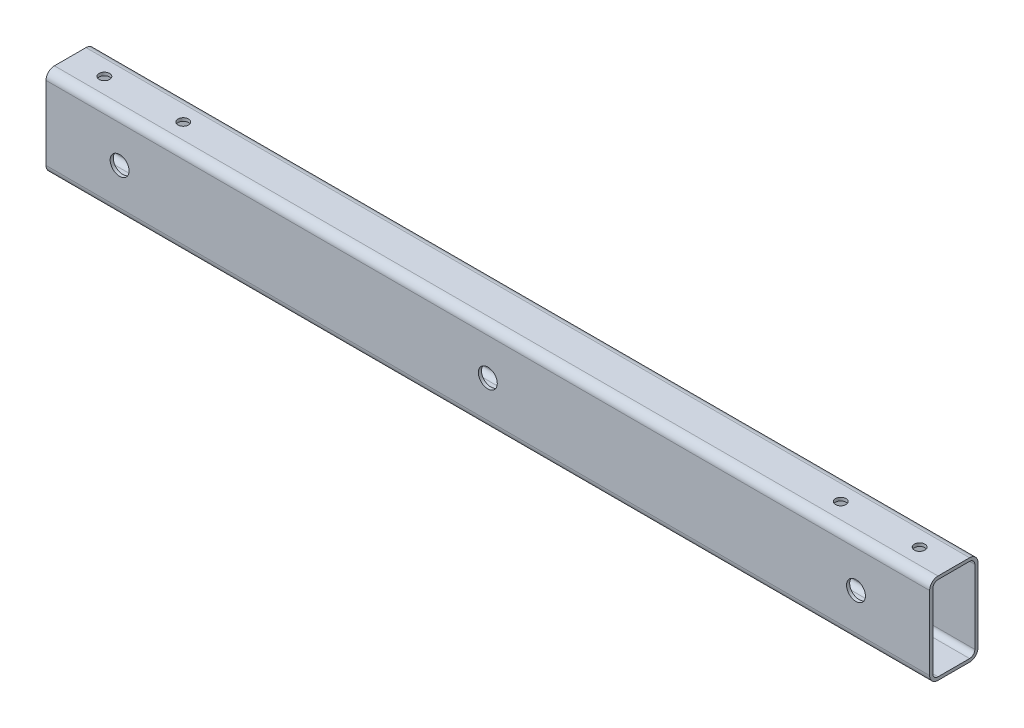
ISO-10303-21;
HEADER;
FILE_DESCRIPTION(('STEP AP214'),'2;1');
FILE_NAME('part.step','',(''),(''),'','','');
FILE_SCHEMA(('AUTOMOTIVE_DESIGN { 1 0 10303 214 1 1 1 1 }'));
ENDSEC;
DATA;
#1=APPLICATION_CONTEXT('core data for automotive mechanical design processes');
#2=APPLICATION_PROTOCOL_DEFINITION('international standard','automotive_design',2000,#1);
#3=PRODUCT_CONTEXT('',#1,'mechanical');
#4=PRODUCT('Part','Part','',(#3));
#5=PRODUCT_RELATED_PRODUCT_CATEGORY('part','',(#4));
#6=PRODUCT_DEFINITION_FORMATION('','',#4);
#7=PRODUCT_DEFINITION_CONTEXT('part definition',#1,'design');
#8=PRODUCT_DEFINITION('design','',#6,#7);
#9=PRODUCT_DEFINITION_SHAPE('','',#8);
#10=(LENGTH_UNIT() NAMED_UNIT(*) SI_UNIT(.MILLI.,.METRE.));
#11=(NAMED_UNIT(*) PLANE_ANGLE_UNIT() SI_UNIT($,.RADIAN.));
#12=(NAMED_UNIT(*) SI_UNIT($,.STERADIAN.) SOLID_ANGLE_UNIT());
#13=UNCERTAINTY_MEASURE_WITH_UNIT(LENGTH_MEASURE(1.E-05),#10,'distance_accuracy_value','');
#14=(GEOMETRIC_REPRESENTATION_CONTEXT(3) GLOBAL_UNCERTAINTY_ASSIGNED_CONTEXT((#13)) GLOBAL_UNIT_ASSIGNED_CONTEXT((#10,
#11,#12)) REPRESENTATION_CONTEXT('',''));
#15=CARTESIAN_POINT('',(0.,0.,0.));
#16=DIRECTION('',(0.,0.,1.));
#17=DIRECTION('',(1.,0.,0.));
#18=AXIS2_PLACEMENT_3D('',#15,#16,#17);
#19=CARTESIAN_POINT('',(-420.,-35.,15.));
#20=DIRECTION('',(1.,0.,0.));
#21=DIRECTION('',(0.,0.,-1.));
#22=AXIS2_PLACEMENT_3D('',#19,#20,#21);
#23=CYLINDRICAL_SURFACE('',#22,8.);
#24=DIRECTION('',(1.,0.,0.));
#25=VECTOR('',#24,1.);
#26=CARTESIAN_POINT('',(-420.,-43.,15.));
#27=LINE('',#26,#25);
#28=CARTESIAN_POINT('',(-420.,-43.,15.));
#29=VERTEX_POINT('',#28);
#30=CARTESIAN_POINT('',(420.,-43.,15.));
#31=VERTEX_POINT('',#30);
#32=EDGE_CURVE('E364',#29,#31,#27,.T.);
#33=ORIENTED_EDGE('',*,*,#32,.T.);
#34=CARTESIAN_POINT('',(420.,-35.,15.));
#35=DIRECTION('',(1.,0.,0.));
#36=DIRECTION('',(0.,0.,-1.));
#37=AXIS2_PLACEMENT_3D('',#34,#35,#36);
#38=CIRCLE('',#37,8.);
#39=CARTESIAN_POINT('',(420.,-35.,23.));
#40=VERTEX_POINT('',#39);
#41=EDGE_CURVE('E288',#40,#31,#38,.T.);
#42=ORIENTED_EDGE('',*,*,#41,.F.);
#43=DIRECTION('',(1.,0.,0.));
#44=VECTOR('',#43,1.);
#45=CARTESIAN_POINT('',(-420.,-35.,23.));
#46=LINE('',#45,#44);
#47=CARTESIAN_POINT('',(-420.,-35.,23.));
#48=VERTEX_POINT('',#47);
#49=EDGE_CURVE('E12',#48,#40,#46,.T.);
#50=ORIENTED_EDGE('',*,*,#49,.F.);
#51=CARTESIAN_POINT('',(-420.,-35.,15.));
#52=DIRECTION('',(1.,0.,0.));
#53=DIRECTION('',(0.,0.,-1.));
#54=AXIS2_PLACEMENT_3D('',#51,#52,#53);
#55=CIRCLE('',#54,8.);
#56=EDGE_CURVE('E331',#48,#29,#55,.T.);
#57=ORIENTED_EDGE('',*,*,#56,.T.);
#58=EDGE_LOOP('',(#33,#42,#50,#57));
#59=FACE_BOUND('',#58,.T.);
#60=ADVANCED_FACE('F130',(#59),#23,.T.);
#61=CARTESIAN_POINT('',(-420.,-35.,23.));
#62=DIRECTION('',(0.,0.,1.));
#63=DIRECTION('',(1.,0.,0.));
#64=AXIS2_PLACEMENT_3D('',#61,#62,#63);
#65=PLANE('',#64);
#66=CARTESIAN_POINT('',(350.,0.,23.));
#67=DIRECTION('',(0.,0.,1.));
#68=DIRECTION('',(-1.,0.,0.));
#69=AXIS2_PLACEMENT_3D('',#66,#67,#68);
#70=CIRCLE('',#69,8.99999999999998);
#71=CARTESIAN_POINT('',(341.,0.,23.));
#72=VERTEX_POINT('',#71);
#73=EDGE_CURVE('E415',#72,#72,#70,.T.);
#74=ORIENTED_EDGE('',*,*,#73,.F.);
#75=EDGE_LOOP('',(#74));
#76=FACE_BOUND('',#75,.T.);
#77=CARTESIAN_POINT('',(-350.,0.,23.));
#78=DIRECTION('',(0.,0.,1.));
#79=DIRECTION('',(1.,0.,0.));
#80=AXIS2_PLACEMENT_3D('',#77,#78,#79);
#81=CIRCLE('',#80,8.99999999999998);
#82=CARTESIAN_POINT('',(-341.,0.,23.));
#83=VERTEX_POINT('',#82);
#84=EDGE_CURVE('E416',#83,#83,#81,.T.);
#85=ORIENTED_EDGE('',*,*,#84,.F.);
#86=EDGE_LOOP('',(#85));
#87=FACE_BOUND('',#86,.T.);
#88=CARTESIAN_POINT('',(0.,0.,23.));
#89=DIRECTION('',(0.,0.,1.));
#90=DIRECTION('',(1.,0.,0.));
#91=AXIS2_PLACEMENT_3D('',#88,#89,#90);
#92=CIRCLE('',#91,9.);
#93=CARTESIAN_POINT('',(9.,0.,23.));
#94=VERTEX_POINT('',#93);
#95=EDGE_CURVE('E423',#94,#94,#92,.T.);
#96=ORIENTED_EDGE('',*,*,#95,.F.);
#97=EDGE_LOOP('',(#96));
#98=FACE_BOUND('',#97,.T.);
#99=ORIENTED_EDGE('',*,*,#49,.T.);
#100=DIRECTION('',(0.,-1.,0.));
#101=VECTOR('',#100,1.);
#102=CARTESIAN_POINT('',(420.,-35.,23.));
#103=LINE('',#102,#101);
#104=CARTESIAN_POINT('',(420.,34.9999999999999,23.));
#105=VERTEX_POINT('',#104);
#106=EDGE_CURVE('E309',#105,#40,#103,.T.);
#107=ORIENTED_EDGE('',*,*,#106,.F.);
#108=DIRECTION('',(1.,0.,0.));
#109=VECTOR('',#108,1.);
#110=CARTESIAN_POINT('',(-420.,34.9999999999999,23.));
#111=LINE('',#110,#109);
#112=CARTESIAN_POINT('',(-420.,34.9999999999999,23.));
#113=VERTEX_POINT('',#112);
#114=EDGE_CURVE('E138',#113,#105,#111,.T.);
#115=ORIENTED_EDGE('',*,*,#114,.F.);
#116=DIRECTION('',(0.,-1.,0.));
#117=VECTOR('',#116,1.);
#118=CARTESIAN_POINT('',(-420.,-35.,23.));
#119=LINE('',#118,#117);
#120=EDGE_CURVE('E362',#113,#48,#119,.T.);
#121=ORIENTED_EDGE('',*,*,#120,.T.);
#122=EDGE_LOOP('',(#99,#107,#115,#121));
#123=FACE_BOUND('',#122,.T.);
#124=ADVANCED_FACE('F464',(#76,#87,#98,#123),#65,.T.);
#125=CARTESIAN_POINT('',(-420.,35.,15.));
#126=DIRECTION('',(1.,0.,0.));
#127=DIRECTION('',(0.,0.,-1.));
#128=AXIS2_PLACEMENT_3D('',#125,#126,#127);
#129=CYLINDRICAL_SURFACE('',#128,8.);
#130=ORIENTED_EDGE('',*,*,#114,.T.);
#131=CARTESIAN_POINT('',(420.,35.,15.));
#132=DIRECTION('',(1.,0.,0.));
#133=DIRECTION('',(0.,0.,-1.));
#134=AXIS2_PLACEMENT_3D('',#131,#132,#133);
#135=CIRCLE('',#134,8.);
#136=CARTESIAN_POINT('',(420.,43.,15.));
#137=VERTEX_POINT('',#136);
#138=EDGE_CURVE('E306',#137,#105,#135,.T.);
#139=ORIENTED_EDGE('',*,*,#138,.F.);
#140=DIRECTION('',(1.,0.,0.));
#141=VECTOR('',#140,1.);
#142=CARTESIAN_POINT('',(-420.,43.,15.));
#143=LINE('',#142,#141);
#144=CARTESIAN_POINT('',(-420.,43.,15.));
#145=VERTEX_POINT('',#144);
#146=EDGE_CURVE('E367',#145,#137,#143,.T.);
#147=ORIENTED_EDGE('',*,*,#146,.F.);
#148=CARTESIAN_POINT('',(-420.,35.,15.));
#149=DIRECTION('',(1.,0.,0.));
#150=DIRECTION('',(0.,0.,-1.));
#151=AXIS2_PLACEMENT_3D('',#148,#149,#150);
#152=CIRCLE('',#151,8.);
#153=EDGE_CURVE('E359',#145,#113,#152,.T.);
#154=ORIENTED_EDGE('',*,*,#153,.T.);
#155=EDGE_LOOP('',(#130,#139,#147,#154));
#156=FACE_BOUND('',#155,.T.);
#157=ADVANCED_FACE('F468',(#156),#129,.T.);
#158=CARTESIAN_POINT('',(-420.,43.,15.));
#159=DIRECTION('',(0.,1.,0.));
#160=DIRECTION('',(0.,0.,1.));
#161=AXIS2_PLACEMENT_3D('',#158,#159,#160);
#162=PLANE('',#161);
#163=CARTESIAN_POINT('',(-387.5,43.,0.));
#164=DIRECTION('',(0.,1.,0.));
#165=DIRECTION('',(0.,0.,1.));
#166=AXIS2_PLACEMENT_3D('',#163,#164,#165);
#167=CIRCLE('',#166,4.99999999999999);
#168=CARTESIAN_POINT('',(-387.5,43.,4.99999999999999));
#169=VERTEX_POINT('',#168);
#170=EDGE_CURVE('E545',#169,#169,#167,.T.);
#171=ORIENTED_EDGE('',*,*,#170,.F.);
#172=EDGE_LOOP('',(#171));
#173=FACE_BOUND('',#172,.T.);
#174=CARTESIAN_POINT('',(-312.5,43.,0.));
#175=DIRECTION('',(0.,1.,0.));
#176=DIRECTION('',(0.,0.,1.));
#177=AXIS2_PLACEMENT_3D('',#174,#175,#176);
#178=CIRCLE('',#177,4.99999999999999);
#179=CARTESIAN_POINT('',(-312.5,43.,4.99999999999999));
#180=VERTEX_POINT('',#179);
#181=EDGE_CURVE('E542',#180,#180,#178,.T.);
#182=ORIENTED_EDGE('',*,*,#181,.F.);
#183=EDGE_LOOP('',(#182));
#184=FACE_BOUND('',#183,.T.);
#185=CARTESIAN_POINT('',(312.5,43.,0.));
#186=DIRECTION('',(0.,1.,0.));
#187=DIRECTION('',(0.,0.,-1.));
#188=AXIS2_PLACEMENT_3D('',#185,#186,#187);
#189=CIRCLE('',#188,4.99999999999999);
#190=CARTESIAN_POINT('',(312.5,43.,-4.99999999999999));
#191=VERTEX_POINT('',#190);
#192=EDGE_CURVE('E535',#191,#191,#189,.T.);
#193=ORIENTED_EDGE('',*,*,#192,.F.);
#194=EDGE_LOOP('',(#193));
#195=FACE_BOUND('',#194,.T.);
#196=CARTESIAN_POINT('',(387.5,43.,0.));
#197=DIRECTION('',(0.,1.,0.));
#198=DIRECTION('',(0.,0.,-1.));
#199=AXIS2_PLACEMENT_3D('',#196,#197,#198);
#200=CIRCLE('',#199,4.99999999999999);
#201=CARTESIAN_POINT('',(387.5,43.,-4.99999999999999));
#202=VERTEX_POINT('',#201);
#203=EDGE_CURVE('E536',#202,#202,#200,.T.);
#204=ORIENTED_EDGE('',*,*,#203,.F.);
#205=EDGE_LOOP('',(#204));
#206=FACE_BOUND('',#205,.T.);
#207=ORIENTED_EDGE('',*,*,#146,.T.);
#208=DIRECTION('',(0.,0.,1.));
#209=VECTOR('',#208,1.);
#210=CARTESIAN_POINT('',(420.,43.,15.));
#211=LINE('',#210,#209);
#212=CARTESIAN_POINT('',(420.,43.,-14.9999999999999));
#213=VERTEX_POINT('',#212);
#214=EDGE_CURVE('E303',#213,#137,#211,.T.);
#215=ORIENTED_EDGE('',*,*,#214,.F.);
#216=DIRECTION('',(1.,0.,0.));
#217=VECTOR('',#216,1.);
#218=CARTESIAN_POINT('',(-420.,43.,-14.9999999999999));
#219=LINE('',#218,#217);
#220=CARTESIAN_POINT('',(-420.,43.,-14.9999999999999));
#221=VERTEX_POINT('',#220);
#222=EDGE_CURVE('E369',#221,#213,#219,.T.);
#223=ORIENTED_EDGE('',*,*,#222,.F.);
#224=DIRECTION('',(0.,0.,1.));
#225=VECTOR('',#224,1.);
#226=CARTESIAN_POINT('',(-420.,43.,15.));
#227=LINE('',#226,#225);
#228=EDGE_CURVE('E356',#221,#145,#227,.T.);
#229=ORIENTED_EDGE('',*,*,#228,.T.);
#230=EDGE_LOOP('',(#207,#215,#223,#229));
#231=FACE_BOUND('',#230,.T.);
#232=ADVANCED_FACE('F497',(#173,#184,#195,#206,#231),#162,.T.);
#233=CARTESIAN_POINT('',(-420.,35.,-15.));
#234=DIRECTION('',(1.,0.,0.));
#235=DIRECTION('',(0.,0.,-1.));
#236=AXIS2_PLACEMENT_3D('',#233,#234,#235);
#237=CYLINDRICAL_SURFACE('',#236,8.);
#238=ORIENTED_EDGE('',*,*,#222,.T.);
#239=CARTESIAN_POINT('',(420.,35.,-15.));
#240=DIRECTION('',(1.,0.,0.));
#241=DIRECTION('',(0.,0.,-1.));
#242=AXIS2_PLACEMENT_3D('',#239,#240,#241);
#243=CIRCLE('',#242,8.);
#244=CARTESIAN_POINT('',(420.,35.,-23.));
#245=VERTEX_POINT('',#244);
#246=EDGE_CURVE('E300',#245,#213,#243,.T.);
#247=ORIENTED_EDGE('',*,*,#246,.F.);
#248=DIRECTION('',(1.,0.,0.));
#249=VECTOR('',#248,1.);
#250=CARTESIAN_POINT('',(-420.,35.,-23.));
#251=LINE('',#250,#249);
#252=CARTESIAN_POINT('',(-420.,35.,-23.));
#253=VERTEX_POINT('',#252);
#254=EDGE_CURVE('E371',#253,#245,#251,.T.);
#255=ORIENTED_EDGE('',*,*,#254,.F.);
#256=CARTESIAN_POINT('',(-420.,35.,-15.));
#257=DIRECTION('',(1.,0.,0.));
#258=DIRECTION('',(0.,0.,-1.));
#259=AXIS2_PLACEMENT_3D('',#256,#257,#258);
#260=CIRCLE('',#259,8.);
#261=EDGE_CURVE('E353',#253,#221,#260,.T.);
#262=ORIENTED_EDGE('',*,*,#261,.T.);
#263=EDGE_LOOP('',(#238,#247,#255,#262));
#264=FACE_BOUND('',#263,.T.);
#265=ADVANCED_FACE('F495',(#264),#237,.T.);
#266=CARTESIAN_POINT('',(-420.,-35.,-23.));
#267=DIRECTION('',(0.,0.,-1.));
#268=DIRECTION('',(-1.,0.,0.));
#269=AXIS2_PLACEMENT_3D('',#266,#267,#268);
#270=PLANE('',#269);
#271=CARTESIAN_POINT('',(350.,0.,-23.));
#272=DIRECTION('',(0.,0.,1.));
#273=DIRECTION('',(-1.,0.,0.));
#274=AXIS2_PLACEMENT_3D('',#271,#272,#273);
#275=CIRCLE('',#274,8.99999999999998);
#276=CARTESIAN_POINT('',(341.,0.,-23.));
#277=VERTEX_POINT('',#276);
#278=EDGE_CURVE('E420',#277,#277,#275,.T.);
#279=ORIENTED_EDGE('',*,*,#278,.T.);
#280=EDGE_LOOP('',(#279));
#281=FACE_BOUND('',#280,.T.);
#282=CARTESIAN_POINT('',(-350.,0.,-23.));
#283=DIRECTION('',(0.,0.,1.));
#284=DIRECTION('',(1.,0.,0.));
#285=AXIS2_PLACEMENT_3D('',#282,#283,#284);
#286=CIRCLE('',#285,8.99999999999998);
#287=CARTESIAN_POINT('',(-341.,0.,-23.));
#288=VERTEX_POINT('',#287);
#289=EDGE_CURVE('E419',#288,#288,#286,.T.);
#290=ORIENTED_EDGE('',*,*,#289,.T.);
#291=EDGE_LOOP('',(#290));
#292=FACE_BOUND('',#291,.T.);
#293=CARTESIAN_POINT('',(0.,0.,-23.));
#294=DIRECTION('',(0.,0.,1.));
#295=DIRECTION('',(1.,0.,0.));
#296=AXIS2_PLACEMENT_3D('',#293,#294,#295);
#297=CIRCLE('',#296,9.);
#298=CARTESIAN_POINT('',(9.,0.,-23.));
#299=VERTEX_POINT('',#298);
#300=EDGE_CURVE('E382',#299,#299,#297,.T.);
#301=ORIENTED_EDGE('',*,*,#300,.T.);
#302=EDGE_LOOP('',(#301));
#303=FACE_BOUND('',#302,.T.);
#304=ORIENTED_EDGE('',*,*,#254,.T.);
#305=DIRECTION('',(0.,1.,0.));
#306=VECTOR('',#305,1.);
#307=CARTESIAN_POINT('',(420.,-35.,-23.));
#308=LINE('',#307,#306);
#309=CARTESIAN_POINT('',(420.,-35.,-23.));
#310=VERTEX_POINT('',#309);
#311=EDGE_CURVE('E297',#310,#245,#308,.T.);
#312=ORIENTED_EDGE('',*,*,#311,.F.);
#313=DIRECTION('',(1.,0.,0.));
#314=VECTOR('',#313,1.);
#315=CARTESIAN_POINT('',(-420.,-35.,-23.));
#316=LINE('',#315,#314);
#317=CARTESIAN_POINT('',(-420.,-35.,-23.));
#318=VERTEX_POINT('',#317);
#319=EDGE_CURVE('E373',#318,#310,#316,.T.);
#320=ORIENTED_EDGE('',*,*,#319,.F.);
#321=DIRECTION('',(0.,1.,0.));
#322=VECTOR('',#321,1.);
#323=CARTESIAN_POINT('',(-420.,-35.,-23.));
#324=LINE('',#323,#322);
#325=EDGE_CURVE('E350',#318,#253,#324,.T.);
#326=ORIENTED_EDGE('',*,*,#325,.T.);
#327=EDGE_LOOP('',(#304,#312,#320,#326));
#328=FACE_BOUND('',#327,.T.);
#329=ADVANCED_FACE('F493',(#281,#292,#303,#328),#270,.T.);
#330=CARTESIAN_POINT('',(-420.,-35.,-15.));
#331=DIRECTION('',(1.,0.,0.));
#332=DIRECTION('',(0.,0.,-1.));
#333=AXIS2_PLACEMENT_3D('',#330,#331,#332);
#334=CYLINDRICAL_SURFACE('',#333,8.);
#335=ORIENTED_EDGE('',*,*,#319,.T.);
#336=CARTESIAN_POINT('',(420.,-35.,-15.));
#337=DIRECTION('',(1.,0.,0.));
#338=DIRECTION('',(0.,0.,-1.));
#339=AXIS2_PLACEMENT_3D('',#336,#337,#338);
#340=CIRCLE('',#339,8.);
#341=CARTESIAN_POINT('',(420.,-43.,-15.));
#342=VERTEX_POINT('',#341);
#343=EDGE_CURVE('E294',#342,#310,#340,.T.);
#344=ORIENTED_EDGE('',*,*,#343,.F.);
#345=DIRECTION('',(1.,0.,0.));
#346=VECTOR('',#345,1.);
#347=CARTESIAN_POINT('',(-420.,-43.,-15.));
#348=LINE('',#347,#346);
#349=CARTESIAN_POINT('',(-420.,-43.,-15.));
#350=VERTEX_POINT('',#349);
#351=EDGE_CURVE('E375',#350,#342,#348,.T.);
#352=ORIENTED_EDGE('',*,*,#351,.F.);
#353=CARTESIAN_POINT('',(-420.,-35.,-15.));
#354=DIRECTION('',(1.,0.,0.));
#355=DIRECTION('',(0.,0.,-1.));
#356=AXIS2_PLACEMENT_3D('',#353,#354,#355);
#357=CIRCLE('',#356,8.);
#358=EDGE_CURVE('E347',#350,#318,#357,.T.);
#359=ORIENTED_EDGE('',*,*,#358,.T.);
#360=EDGE_LOOP('',(#335,#344,#352,#359));
#361=FACE_BOUND('',#360,.T.);
#362=ADVANCED_FACE('F489',(#361),#334,.T.);
#363=CARTESIAN_POINT('',(-420.,-43.,15.));
#364=DIRECTION('',(0.,-1.,0.));
#365=DIRECTION('',(0.,0.,-1.));
#366=AXIS2_PLACEMENT_3D('',#363,#364,#365);
#367=PLANE('',#366);
#368=CARTESIAN_POINT('',(-387.5,-43.,0.));
#369=DIRECTION('',(0.,1.,0.));
#370=DIRECTION('',(0.,0.,1.));
#371=AXIS2_PLACEMENT_3D('',#368,#369,#370);
#372=CIRCLE('',#371,4.99999999999999);
#373=CARTESIAN_POINT('',(-387.5,-43.,4.99999999999999));
#374=VERTEX_POINT('',#373);
#375=EDGE_CURVE('E394',#374,#374,#372,.T.);
#376=ORIENTED_EDGE('',*,*,#375,.T.);
#377=EDGE_LOOP('',(#376));
#378=FACE_BOUND('',#377,.T.);
#379=CARTESIAN_POINT('',(-312.5,-43.,0.));
#380=DIRECTION('',(0.,1.,0.));
#381=DIRECTION('',(0.,0.,1.));
#382=AXIS2_PLACEMENT_3D('',#379,#380,#381);
#383=CIRCLE('',#382,4.99999999999999);
#384=CARTESIAN_POINT('',(-312.5,-43.,4.99999999999999));
#385=VERTEX_POINT('',#384);
#386=EDGE_CURVE('E527',#385,#385,#383,.T.);
#387=ORIENTED_EDGE('',*,*,#386,.T.);
#388=EDGE_LOOP('',(#387));
#389=FACE_BOUND('',#388,.T.);
#390=CARTESIAN_POINT('',(312.5,-43.,0.));
#391=DIRECTION('',(0.,1.,0.));
#392=DIRECTION('',(0.,0.,-1.));
#393=AXIS2_PLACEMENT_3D('',#390,#391,#392);
#394=CIRCLE('',#393,4.99999999999999);
#395=CARTESIAN_POINT('',(312.5,-43.,-4.99999999999999));
#396=VERTEX_POINT('',#395);
#397=EDGE_CURVE('E531',#396,#396,#394,.T.);
#398=ORIENTED_EDGE('',*,*,#397,.T.);
#399=EDGE_LOOP('',(#398));
#400=FACE_BOUND('',#399,.T.);
#401=CARTESIAN_POINT('',(387.5,-43.,0.));
#402=DIRECTION('',(0.,1.,0.));
#403=DIRECTION('',(0.,0.,-1.));
#404=AXIS2_PLACEMENT_3D('',#401,#402,#403);
#405=CIRCLE('',#404,4.99999999999999);
#406=CARTESIAN_POINT('',(387.5,-43.,-4.99999999999999));
#407=VERTEX_POINT('',#406);
#408=EDGE_CURVE('E534',#407,#407,#405,.T.);
#409=ORIENTED_EDGE('',*,*,#408,.T.);
#410=EDGE_LOOP('',(#409));
#411=FACE_BOUND('',#410,.T.);
#412=ORIENTED_EDGE('',*,*,#351,.T.);
#413=DIRECTION('',(0.,0.,-1.));
#414=VECTOR('',#413,1.);
#415=CARTESIAN_POINT('',(420.,-43.,15.));
#416=LINE('',#415,#414);
#417=EDGE_CURVE('E291',#31,#342,#416,.T.);
#418=ORIENTED_EDGE('',*,*,#417,.F.);
#419=ORIENTED_EDGE('',*,*,#32,.F.);
#420=DIRECTION('',(0.,0.,-1.));
#421=VECTOR('',#420,1.);
#422=CARTESIAN_POINT('',(-420.,-43.,15.));
#423=LINE('',#422,#421);
#424=EDGE_CURVE('E344',#29,#350,#423,.T.);
#425=ORIENTED_EDGE('',*,*,#424,.T.);
#426=EDGE_LOOP('',(#412,#418,#419,#425));
#427=FACE_BOUND('',#426,.T.);
#428=ADVANCED_FACE('F474',(#378,#389,#400,#411,#427),#367,.T.);
#429=CARTESIAN_POINT('',(-420.,-35.,15.));
#430=DIRECTION('',(1.,0.,0.));
#431=DIRECTION('',(0.,0.,-1.));
#432=AXIS2_PLACEMENT_3D('',#429,#430,#431);
#433=PLANE('',#432);
#434=DIRECTION('',(0.,-1.,0.));
#435=VECTOR('',#434,1.);
#436=CARTESIAN_POINT('',(-420.,-35.,20.));
#437=LINE('',#436,#435);
#438=CARTESIAN_POINT('',(-420.,35.,20.));
#439=VERTEX_POINT('',#438);
#440=CARTESIAN_POINT('',(-420.,-35.,20.));
#441=VERTEX_POINT('',#440);
#442=EDGE_CURVE('E255',#439,#441,#437,.T.);
#443=ORIENTED_EDGE('',*,*,#442,.T.);
#444=CARTESIAN_POINT('',(-420.,-35.,15.));
#445=DIRECTION('',(1.,0.,0.));
#446=DIRECTION('',(0.,0.,-1.));
#447=AXIS2_PLACEMENT_3D('',#444,#445,#446);
#448=CIRCLE('',#447,5.);
#449=CARTESIAN_POINT('',(-420.,-40.,15.));
#450=VERTEX_POINT('',#449);
#451=EDGE_CURVE('E312',#441,#450,#448,.T.);
#452=ORIENTED_EDGE('',*,*,#451,.T.);
#453=DIRECTION('',(0.,0.,-1.));
#454=VECTOR('',#453,1.);
#455=CARTESIAN_POINT('',(-420.,-40.,15.));
#456=LINE('',#455,#454);
#457=CARTESIAN_POINT('',(-420.,-40.,-15.));
#458=VERTEX_POINT('',#457);
#459=EDGE_CURVE('E250',#450,#458,#456,.T.);
#460=ORIENTED_EDGE('',*,*,#459,.T.);
#461=CARTESIAN_POINT('',(-420.,-35.,-15.));
#462=DIRECTION('',(1.,0.,0.));
#463=DIRECTION('',(0.,0.,-1.));
#464=AXIS2_PLACEMENT_3D('',#461,#462,#463);
#465=CIRCLE('',#464,5.);
#466=CARTESIAN_POINT('',(-420.,-35.,-20.));
#467=VERTEX_POINT('',#466);
#468=EDGE_CURVE('E146',#458,#467,#465,.T.);
#469=ORIENTED_EDGE('',*,*,#468,.T.);
#470=DIRECTION('',(0.,1.,0.));
#471=VECTOR('',#470,1.);
#472=CARTESIAN_POINT('',(-420.,-35.,-20.));
#473=LINE('',#472,#471);
#474=CARTESIAN_POINT('',(-420.,35.,-20.));
#475=VERTEX_POINT('',#474);
#476=EDGE_CURVE('E316',#467,#475,#473,.T.);
#477=ORIENTED_EDGE('',*,*,#476,.T.);
#478=CARTESIAN_POINT('',(-420.,35.,-15.));
#479=DIRECTION('',(1.,0.,0.));
#480=DIRECTION('',(0.,0.,-1.));
#481=AXIS2_PLACEMENT_3D('',#478,#479,#480);
#482=CIRCLE('',#481,5.);
#483=CARTESIAN_POINT('',(-420.,40.,-15.));
#484=VERTEX_POINT('',#483);
#485=EDGE_CURVE('E319',#475,#484,#482,.T.);
#486=ORIENTED_EDGE('',*,*,#485,.T.);
#487=DIRECTION('',(0.,0.,1.));
#488=VECTOR('',#487,1.);
#489=CARTESIAN_POINT('',(-420.,40.,15.));
#490=LINE('',#489,#488);
#491=CARTESIAN_POINT('',(-420.,40.,15.));
#492=VERTEX_POINT('',#491);
#493=EDGE_CURVE('E322',#484,#492,#490,.T.);
#494=ORIENTED_EDGE('',*,*,#493,.T.);
#495=CARTESIAN_POINT('',(-420.,35.,15.));
#496=DIRECTION('',(1.,0.,0.));
#497=DIRECTION('',(0.,0.,-1.));
#498=AXIS2_PLACEMENT_3D('',#495,#496,#497);
#499=CIRCLE('',#498,5.);
#500=EDGE_CURVE('E325',#492,#439,#499,.T.);
#501=ORIENTED_EDGE('',*,*,#500,.T.);
#502=EDGE_LOOP('',(#443,#452,#460,#469,#477,#486,#494,#501));
#503=FACE_BOUND('',#502,.T.);
#504=ORIENTED_EDGE('',*,*,#56,.F.);
#505=ORIENTED_EDGE('',*,*,#120,.F.);
#506=ORIENTED_EDGE('',*,*,#153,.F.);
#507=ORIENTED_EDGE('',*,*,#228,.F.);
#508=ORIENTED_EDGE('',*,*,#261,.F.);
#509=ORIENTED_EDGE('',*,*,#325,.F.);
#510=ORIENTED_EDGE('',*,*,#358,.F.);
#511=ORIENTED_EDGE('',*,*,#424,.F.);
#512=EDGE_LOOP('',(#504,#505,#506,#507,#508,#509,#510,#511));
#513=FACE_BOUND('',#512,.T.);
#514=ADVANCED_FACE('F483',(#503,#513),#433,.F.);
#515=CARTESIAN_POINT('',(-420.,-35.,15.));
#516=DIRECTION('',(1.,0.,0.));
#517=DIRECTION('',(0.,0.,-1.));
#518=AXIS2_PLACEMENT_3D('',#515,#516,#517);
#519=CYLINDRICAL_SURFACE('',#518,5.);
#520=DIRECTION('',(1.,0.,0.));
#521=VECTOR('',#520,1.);
#522=CARTESIAN_POINT('',(-420.,-35.,20.));
#523=LINE('',#522,#521);
#524=CARTESIAN_POINT('',(420.,-35.,20.));
#525=VERTEX_POINT('',#524);
#526=EDGE_CURVE('E260',#441,#525,#523,.T.);
#527=ORIENTED_EDGE('',*,*,#526,.T.);
#528=CARTESIAN_POINT('',(420.,-35.,15.));
#529=DIRECTION('',(1.,0.,0.));
#530=DIRECTION('',(0.,0.,-1.));
#531=AXIS2_PLACEMENT_3D('',#528,#529,#530);
#532=CIRCLE('',#531,5.);
#533=CARTESIAN_POINT('',(420.,-40.,15.));
#534=VERTEX_POINT('',#533);
#535=EDGE_CURVE('E258',#525,#534,#532,.T.);
#536=ORIENTED_EDGE('',*,*,#535,.T.);
#537=DIRECTION('',(1.,0.,0.));
#538=VECTOR('',#537,1.);
#539=CARTESIAN_POINT('',(-420.,-40.,15.));
#540=LINE('',#539,#538);
#541=EDGE_CURVE('E243',#450,#534,#540,.T.);
#542=ORIENTED_EDGE('',*,*,#541,.F.);
#543=ORIENTED_EDGE('',*,*,#451,.F.);
#544=EDGE_LOOP('',(#527,#536,#542,#543));
#545=FACE_BOUND('',#544,.T.);
#546=ADVANCED_FACE('F259',(#545),#519,.F.);
#547=CARTESIAN_POINT('',(-420.,-35.,20.));
#548=DIRECTION('',(0.,0.,1.));
#549=DIRECTION('',(1.,0.,0.));
#550=AXIS2_PLACEMENT_3D('',#547,#548,#549);
#551=PLANE('',#550);
#552=CARTESIAN_POINT('',(350.,0.,20.));
#553=DIRECTION('',(0.,0.,1.));
#554=DIRECTION('',(1.,0.,0.));
#555=AXIS2_PLACEMENT_3D('',#552,#553,#554);
#556=CIRCLE('',#555,8.99999999999998);
#557=CARTESIAN_POINT('',(359.,0.,20.));
#558=VERTEX_POINT('',#557);
#559=EDGE_CURVE('E264',#558,#558,#556,.T.);
#560=ORIENTED_EDGE('',*,*,#559,.T.);
#561=EDGE_LOOP('',(#560));
#562=FACE_BOUND('',#561,.T.);
#563=CARTESIAN_POINT('',(-350.,0.,20.));
#564=DIRECTION('',(0.,0.,1.));
#565=DIRECTION('',(1.,0.,0.));
#566=AXIS2_PLACEMENT_3D('',#563,#564,#565);
#567=CIRCLE('',#566,8.99999999999998);
#568=CARTESIAN_POINT('',(-341.,0.,20.));
#569=VERTEX_POINT('',#568);
#570=EDGE_CURVE('E386',#569,#569,#567,.T.);
#571=ORIENTED_EDGE('',*,*,#570,.T.);
#572=EDGE_LOOP('',(#571));
#573=FACE_BOUND('',#572,.T.);
#574=CARTESIAN_POINT('',(0.,0.,20.));
#575=DIRECTION('',(0.,0.,1.));
#576=DIRECTION('',(1.,0.,0.));
#577=AXIS2_PLACEMENT_3D('',#574,#575,#576);
#578=CIRCLE('',#577,9.);
#579=CARTESIAN_POINT('',(9.,0.,20.));
#580=VERTEX_POINT('',#579);
#581=EDGE_CURVE('E381',#580,#580,#578,.T.);
#582=ORIENTED_EDGE('',*,*,#581,.T.);
#583=EDGE_LOOP('',(#582));
#584=FACE_BOUND('',#583,.T.);
#585=DIRECTION('',(1.,0.,0.));
#586=VECTOR('',#585,1.);
#587=CARTESIAN_POINT('',(-420.,35.,20.));
#588=LINE('',#587,#586);
#589=CARTESIAN_POINT('',(420.,35.,20.));
#590=VERTEX_POINT('',#589);
#591=EDGE_CURVE('E332',#439,#590,#588,.T.);
#592=ORIENTED_EDGE('',*,*,#591,.T.);
#593=DIRECTION('',(0.,-1.,0.));
#594=VECTOR('',#593,1.);
#595=CARTESIAN_POINT('',(420.,-35.,20.));
#596=LINE('',#595,#594);
#597=EDGE_CURVE('E286',#590,#525,#596,.T.);
#598=ORIENTED_EDGE('',*,*,#597,.T.);
#599=ORIENTED_EDGE('',*,*,#526,.F.);
#600=ORIENTED_EDGE('',*,*,#442,.F.);
#601=EDGE_LOOP('',(#592,#598,#599,#600));
#602=FACE_BOUND('',#601,.T.);
#603=ADVANCED_FACE('F438',(#562,#573,#584,#602),#551,.F.);
#604=CARTESIAN_POINT('',(-420.,35.,15.));
#605=DIRECTION('',(1.,0.,0.));
#606=DIRECTION('',(0.,0.,-1.));
#607=AXIS2_PLACEMENT_3D('',#604,#605,#606);
#608=CYLINDRICAL_SURFACE('',#607,5.);
#609=DIRECTION('',(1.,0.,0.));
#610=VECTOR('',#609,1.);
#611=CARTESIAN_POINT('',(-420.,40.,15.));
#612=LINE('',#611,#610);
#613=CARTESIAN_POINT('',(420.,40.,15.));
#614=VERTEX_POINT('',#613);
#615=EDGE_CURVE('E334',#492,#614,#612,.T.);
#616=ORIENTED_EDGE('',*,*,#615,.T.);
#617=CARTESIAN_POINT('',(420.,35.,15.));
#618=DIRECTION('',(1.,0.,0.));
#619=DIRECTION('',(0.,0.,-1.));
#620=AXIS2_PLACEMENT_3D('',#617,#618,#619);
#621=CIRCLE('',#620,5.);
#622=EDGE_CURVE('E283',#614,#590,#621,.T.);
#623=ORIENTED_EDGE('',*,*,#622,.T.);
#624=ORIENTED_EDGE('',*,*,#591,.F.);
#625=ORIENTED_EDGE('',*,*,#500,.F.);
#626=EDGE_LOOP('',(#616,#623,#624,#625));
#627=FACE_BOUND('',#626,.T.);
#628=ADVANCED_FACE('F572',(#627),#608,.F.);
#629=CARTESIAN_POINT('',(-420.,40.,15.));
#630=DIRECTION('',(0.,1.,0.));
#631=DIRECTION('',(0.,0.,1.));
#632=AXIS2_PLACEMENT_3D('',#629,#630,#631);
#633=PLANE('',#632);
#634=CARTESIAN_POINT('',(-387.5,40.,0.));
#635=DIRECTION('',(0.,1.,0.));
#636=DIRECTION('',(0.,0.,1.));
#637=AXIS2_PLACEMENT_3D('',#634,#635,#636);
#638=CIRCLE('',#637,4.99999999999999);
#639=CARTESIAN_POINT('',(-387.5,40.,4.99999999999999));
#640=VERTEX_POINT('',#639);
#641=EDGE_CURVE('E412',#640,#640,#638,.T.);
#642=ORIENTED_EDGE('',*,*,#641,.T.);
#643=EDGE_LOOP('',(#642));
#644=FACE_BOUND('',#643,.T.);
#645=CARTESIAN_POINT('',(-312.5,40.,0.));
#646=DIRECTION('',(0.,1.,0.));
#647=DIRECTION('',(0.,0.,1.));
#648=AXIS2_PLACEMENT_3D('',#645,#646,#647);
#649=CIRCLE('',#648,4.99999999999999);
#650=CARTESIAN_POINT('',(-312.5,40.,4.99999999999999));
#651=VERTEX_POINT('',#650);
#652=EDGE_CURVE('E400',#651,#651,#649,.T.);
#653=ORIENTED_EDGE('',*,*,#652,.T.);
#654=EDGE_LOOP('',(#653));
#655=FACE_BOUND('',#654,.T.);
#656=CARTESIAN_POINT('',(312.5,40.,0.));
#657=DIRECTION('',(0.,1.,0.));
#658=DIRECTION('',(0.,0.,1.));
#659=AXIS2_PLACEMENT_3D('',#656,#657,#658);
#660=CIRCLE('',#659,4.99999999999999);
#661=CARTESIAN_POINT('',(312.5,40.,4.99999999999999));
#662=VERTEX_POINT('',#661);
#663=EDGE_CURVE('E397',#662,#662,#660,.T.);
#664=ORIENTED_EDGE('',*,*,#663,.T.);
#665=EDGE_LOOP('',(#664));
#666=FACE_BOUND('',#665,.T.);
#667=CARTESIAN_POINT('',(387.5,40.,0.));
#668=DIRECTION('',(0.,1.,0.));
#669=DIRECTION('',(0.,0.,1.));
#670=AXIS2_PLACEMENT_3D('',#667,#668,#669);
#671=CIRCLE('',#670,4.99999999999999);
#672=CARTESIAN_POINT('',(387.5,40.,4.99999999999999));
#673=VERTEX_POINT('',#672);
#674=EDGE_CURVE('E393',#673,#673,#671,.T.);
#675=ORIENTED_EDGE('',*,*,#674,.T.);
#676=EDGE_LOOP('',(#675));
#677=FACE_BOUND('',#676,.T.);
#678=DIRECTION('',(1.,0.,0.));
#679=VECTOR('',#678,1.);
#680=CARTESIAN_POINT('',(-420.,40.,-15.));
#681=LINE('',#680,#679);
#682=CARTESIAN_POINT('',(420.,40.,-15.));
#683=VERTEX_POINT('',#682);
#684=EDGE_CURVE('E336',#484,#683,#681,.T.);
#685=ORIENTED_EDGE('',*,*,#684,.T.);
#686=DIRECTION('',(0.,0.,1.));
#687=VECTOR('',#686,1.);
#688=CARTESIAN_POINT('',(420.,40.,15.));
#689=LINE('',#688,#687);
#690=EDGE_CURVE('E280',#683,#614,#689,.T.);
#691=ORIENTED_EDGE('',*,*,#690,.T.);
#692=ORIENTED_EDGE('',*,*,#615,.F.);
#693=ORIENTED_EDGE('',*,*,#493,.F.);
#694=EDGE_LOOP('',(#685,#691,#692,#693));
#695=FACE_BOUND('',#694,.T.);
#696=ADVANCED_FACE('F568',(#644,#655,#666,#677,#695),#633,.F.);
#697=CARTESIAN_POINT('',(-420.,35.,-15.));
#698=DIRECTION('',(1.,0.,0.));
#699=DIRECTION('',(0.,0.,-1.));
#700=AXIS2_PLACEMENT_3D('',#697,#698,#699);
#701=CYLINDRICAL_SURFACE('',#700,5.);
#702=DIRECTION('',(1.,0.,0.));
#703=VECTOR('',#702,1.);
#704=CARTESIAN_POINT('',(-420.,35.,-20.));
#705=LINE('',#704,#703);
#706=CARTESIAN_POINT('',(420.,35.,-20.));
#707=VERTEX_POINT('',#706);
#708=EDGE_CURVE('E338',#475,#707,#705,.T.);
#709=ORIENTED_EDGE('',*,*,#708,.T.);
#710=CARTESIAN_POINT('',(420.,35.,-15.));
#711=DIRECTION('',(1.,0.,0.));
#712=DIRECTION('',(0.,0.,-1.));
#713=AXIS2_PLACEMENT_3D('',#710,#711,#712);
#714=CIRCLE('',#713,5.);
#715=EDGE_CURVE('E277',#707,#683,#714,.T.);
#716=ORIENTED_EDGE('',*,*,#715,.T.);
#717=ORIENTED_EDGE('',*,*,#684,.F.);
#718=ORIENTED_EDGE('',*,*,#485,.F.);
#719=EDGE_LOOP('',(#709,#716,#717,#718));
#720=FACE_BOUND('',#719,.T.);
#721=ADVANCED_FACE('F571',(#720),#701,.F.);
#722=CARTESIAN_POINT('',(-420.,-35.,-20.));
#723=DIRECTION('',(0.,0.,-1.));
#724=DIRECTION('',(-1.,0.,0.));
#725=AXIS2_PLACEMENT_3D('',#722,#723,#724);
#726=PLANE('',#725);
#727=CARTESIAN_POINT('',(350.,0.,-20.));
#728=DIRECTION('',(0.,0.,-1.));
#729=DIRECTION('',(-1.,0.,0.));
#730=AXIS2_PLACEMENT_3D('',#727,#728,#729);
#731=CIRCLE('',#730,8.99999999999998);
#732=CARTESIAN_POINT('',(341.,0.,-20.));
#733=VERTEX_POINT('',#732);
#734=EDGE_CURVE('E387',#733,#733,#731,.T.);
#735=ORIENTED_EDGE('',*,*,#734,.T.);
#736=EDGE_LOOP('',(#735));
#737=FACE_BOUND('',#736,.T.);
#738=CARTESIAN_POINT('',(-350.,0.,-20.));
#739=DIRECTION('',(0.,0.,-1.));
#740=DIRECTION('',(-1.,0.,0.));
#741=AXIS2_PLACEMENT_3D('',#738,#739,#740);
#742=CIRCLE('',#741,8.99999999999998);
#743=CARTESIAN_POINT('',(-359.,0.,-20.));
#744=VERTEX_POINT('',#743);
#745=EDGE_CURVE('E383',#744,#744,#742,.T.);
#746=ORIENTED_EDGE('',*,*,#745,.T.);
#747=EDGE_LOOP('',(#746));
#748=FACE_BOUND('',#747,.T.);
#749=CARTESIAN_POINT('',(0.,0.,-20.));
#750=DIRECTION('',(0.,0.,-1.));
#751=DIRECTION('',(-1.,0.,0.));
#752=AXIS2_PLACEMENT_3D('',#749,#750,#751);
#753=CIRCLE('',#752,9.);
#754=CARTESIAN_POINT('',(-9.,0.,-20.));
#755=VERTEX_POINT('',#754);
#756=EDGE_CURVE('E378',#755,#755,#753,.T.);
#757=ORIENTED_EDGE('',*,*,#756,.T.);
#758=EDGE_LOOP('',(#757));
#759=FACE_BOUND('',#758,.T.);
#760=DIRECTION('',(1.,0.,0.));
#761=VECTOR('',#760,1.);
#762=CARTESIAN_POINT('',(-420.,-35.,-20.));
#763=LINE('',#762,#761);
#764=CARTESIAN_POINT('',(420.,-35.,-20.));
#765=VERTEX_POINT('',#764);
#766=EDGE_CURVE('E340',#467,#765,#763,.T.);
#767=ORIENTED_EDGE('',*,*,#766,.T.);
#768=DIRECTION('',(0.,1.,0.));
#769=VECTOR('',#768,1.);
#770=CARTESIAN_POINT('',(420.,-35.,-20.));
#771=LINE('',#770,#769);
#772=EDGE_CURVE('E271',#765,#707,#771,.T.);
#773=ORIENTED_EDGE('',*,*,#772,.T.);
#774=ORIENTED_EDGE('',*,*,#708,.F.);
#775=ORIENTED_EDGE('',*,*,#476,.F.);
#776=EDGE_LOOP('',(#767,#773,#774,#775));
#777=FACE_BOUND('',#776,.T.);
#778=ADVANCED_FACE('F586',(#737,#748,#759,#777),#726,.F.);
#779=CARTESIAN_POINT('',(-420.,-35.,-15.));
#780=DIRECTION('',(1.,0.,0.));
#781=DIRECTION('',(0.,0.,-1.));
#782=AXIS2_PLACEMENT_3D('',#779,#780,#781);
#783=CYLINDRICAL_SURFACE('',#782,5.);
#784=DIRECTION('',(1.,0.,0.));
#785=VECTOR('',#784,1.);
#786=CARTESIAN_POINT('',(-420.,-40.,-15.));
#787=LINE('',#786,#785);
#788=CARTESIAN_POINT('',(420.,-40.,-15.));
#789=VERTEX_POINT('',#788);
#790=EDGE_CURVE('E254',#458,#789,#787,.T.);
#791=ORIENTED_EDGE('',*,*,#790,.T.);
#792=CARTESIAN_POINT('',(420.,-35.,-15.));
#793=DIRECTION('',(1.,0.,0.));
#794=DIRECTION('',(0.,0.,-1.));
#795=AXIS2_PLACEMENT_3D('',#792,#793,#794);
#796=CIRCLE('',#795,5.);
#797=EDGE_CURVE('E269',#789,#765,#796,.T.);
#798=ORIENTED_EDGE('',*,*,#797,.T.);
#799=ORIENTED_EDGE('',*,*,#766,.F.);
#800=ORIENTED_EDGE('',*,*,#468,.F.);
#801=EDGE_LOOP('',(#791,#798,#799,#800));
#802=FACE_BOUND('',#801,.T.);
#803=ADVANCED_FACE('F587',(#802),#783,.F.);
#804=CARTESIAN_POINT('',(-420.,-40.,15.));
#805=DIRECTION('',(0.,-1.,0.));
#806=DIRECTION('',(0.,0.,-1.));
#807=AXIS2_PLACEMENT_3D('',#804,#805,#806);
#808=PLANE('',#807);
#809=CARTESIAN_POINT('',(-387.5,-40.,0.));
#810=DIRECTION('',(0.,-1.,0.));
#811=DIRECTION('',(0.,0.,-1.));
#812=AXIS2_PLACEMENT_3D('',#809,#810,#811);
#813=CIRCLE('',#812,4.99999999999999);
#814=CARTESIAN_POINT('',(-387.5,-40.,-4.99999999999999));
#815=VERTEX_POINT('',#814);
#816=EDGE_CURVE('E133',#815,#815,#813,.T.);
#817=ORIENTED_EDGE('',*,*,#816,.T.);
#818=EDGE_LOOP('',(#817));
#819=FACE_BOUND('',#818,.T.);
#820=CARTESIAN_POINT('',(-312.5,-40.,0.));
#821=DIRECTION('',(0.,-1.,0.));
#822=DIRECTION('',(0.,0.,-1.));
#823=AXIS2_PLACEMENT_3D('',#820,#821,#822);
#824=CIRCLE('',#823,4.99999999999999);
#825=CARTESIAN_POINT('',(-312.5,-40.,-4.99999999999999));
#826=VERTEX_POINT('',#825);
#827=EDGE_CURVE('E398',#826,#826,#824,.T.);
#828=ORIENTED_EDGE('',*,*,#827,.T.);
#829=EDGE_LOOP('',(#828));
#830=FACE_BOUND('',#829,.T.);
#831=CARTESIAN_POINT('',(312.5,-40.,0.));
#832=DIRECTION('',(0.,-1.,0.));
#833=DIRECTION('',(0.,0.,-1.));
#834=AXIS2_PLACEMENT_3D('',#831,#832,#833);
#835=CIRCLE('',#834,4.99999999999999);
#836=CARTESIAN_POINT('',(312.5,-40.,-4.99999999999999));
#837=VERTEX_POINT('',#836);
#838=EDGE_CURVE('E395',#837,#837,#835,.T.);
#839=ORIENTED_EDGE('',*,*,#838,.T.);
#840=EDGE_LOOP('',(#839));
#841=FACE_BOUND('',#840,.T.);
#842=CARTESIAN_POINT('',(387.5,-40.,0.));
#843=DIRECTION('',(0.,-1.,0.));
#844=DIRECTION('',(0.,0.,-1.));
#845=AXIS2_PLACEMENT_3D('',#842,#843,#844);
#846=CIRCLE('',#845,4.99999999999999);
#847=CARTESIAN_POINT('',(387.5,-40.,-4.99999999999999));
#848=VERTEX_POINT('',#847);
#849=EDGE_CURVE('E390',#848,#848,#846,.T.);
#850=ORIENTED_EDGE('',*,*,#849,.T.);
#851=EDGE_LOOP('',(#850));
#852=FACE_BOUND('',#851,.T.);
#853=ORIENTED_EDGE('',*,*,#541,.T.);
#854=DIRECTION('',(0.,0.,-1.));
#855=VECTOR('',#854,1.);
#856=CARTESIAN_POINT('',(420.,-40.,15.));
#857=LINE('',#856,#855);
#858=EDGE_CURVE('E247',#534,#789,#857,.T.);
#859=ORIENTED_EDGE('',*,*,#858,.T.);
#860=ORIENTED_EDGE('',*,*,#790,.F.);
#861=ORIENTED_EDGE('',*,*,#459,.F.);
#862=EDGE_LOOP('',(#853,#859,#860,#861));
#863=FACE_BOUND('',#862,.T.);
#864=ADVANCED_FACE('F245',(#819,#830,#841,#852,#863),#808,.F.);
#865=CARTESIAN_POINT('',(420.,-35.,15.));
#866=DIRECTION('',(1.,0.,0.));
#867=DIRECTION('',(0.,0.,-1.));
#868=AXIS2_PLACEMENT_3D('',#865,#866,#867);
#869=PLANE('',#868);
#870=ORIENTED_EDGE('',*,*,#41,.T.);
#871=ORIENTED_EDGE('',*,*,#417,.T.);
#872=ORIENTED_EDGE('',*,*,#343,.T.);
#873=ORIENTED_EDGE('',*,*,#311,.T.);
#874=ORIENTED_EDGE('',*,*,#246,.T.);
#875=ORIENTED_EDGE('',*,*,#214,.T.);
#876=ORIENTED_EDGE('',*,*,#138,.T.);
#877=ORIENTED_EDGE('',*,*,#106,.T.);
#878=EDGE_LOOP('',(#870,#871,#872,#873,#874,#875,#876,#877));
#879=FACE_BOUND('',#878,.T.);
#880=ORIENTED_EDGE('',*,*,#858,.F.);
#881=ORIENTED_EDGE('',*,*,#535,.F.);
#882=ORIENTED_EDGE('',*,*,#597,.F.);
#883=ORIENTED_EDGE('',*,*,#622,.F.);
#884=ORIENTED_EDGE('',*,*,#690,.F.);
#885=ORIENTED_EDGE('',*,*,#715,.F.);
#886=ORIENTED_EDGE('',*,*,#772,.F.);
#887=ORIENTED_EDGE('',*,*,#797,.F.);
#888=EDGE_LOOP('',(#880,#881,#882,#883,#884,#885,#886,#887));
#889=FACE_BOUND('',#888,.T.);
#890=ADVANCED_FACE('F266',(#879,#889),#869,.T.);
#891=CARTESIAN_POINT('',(0.,0.,-23.));
#892=DIRECTION('',(0.,0.,1.));
#893=DIRECTION('',(1.,0.,0.));
#894=AXIS2_PLACEMENT_3D('',#891,#892,#893);
#895=CYLINDRICAL_SURFACE('',#894,9.);
#896=ORIENTED_EDGE('',*,*,#300,.F.);
#897=EDGE_LOOP('',(#896));
#898=FACE_BOUND('',#897,.T.);
#899=ORIENTED_EDGE('',*,*,#756,.F.);
#900=EDGE_LOOP('',(#899));
#901=FACE_BOUND('',#900,.T.);
#902=ADVANCED_FACE('F611',(#898,#901),#895,.F.);
#903=CARTESIAN_POINT('',(-350.,0.,-23.));
#904=DIRECTION('',(0.,0.,1.));
#905=DIRECTION('',(1.,0.,0.));
#906=AXIS2_PLACEMENT_3D('',#903,#904,#905);
#907=CYLINDRICAL_SURFACE('',#906,8.99999999999998);
#908=ORIENTED_EDGE('',*,*,#289,.F.);
#909=EDGE_LOOP('',(#908));
#910=FACE_BOUND('',#909,.T.);
#911=ORIENTED_EDGE('',*,*,#745,.F.);
#912=EDGE_LOOP('',(#911));
#913=FACE_BOUND('',#912,.T.);
#914=ADVANCED_FACE('F459',(#910,#913),#907,.F.);
#915=CARTESIAN_POINT('',(350.,0.,-23.));
#916=DIRECTION('',(0.,0.,1.));
#917=DIRECTION('',(1.,0.,0.));
#918=AXIS2_PLACEMENT_3D('',#915,#916,#917);
#919=CYLINDRICAL_SURFACE('',#918,8.99999999999998);
#920=ORIENTED_EDGE('',*,*,#278,.F.);
#921=EDGE_LOOP('',(#920));
#922=FACE_BOUND('',#921,.T.);
#923=ORIENTED_EDGE('',*,*,#734,.F.);
#924=EDGE_LOOP('',(#923));
#925=FACE_BOUND('',#924,.T.);
#926=ADVANCED_FACE('F447',(#922,#925),#919,.F.);
#927=ORIENTED_EDGE('',*,*,#95,.T.);
#928=EDGE_LOOP('',(#927));
#929=FACE_BOUND('',#928,.T.);
#930=ORIENTED_EDGE('',*,*,#581,.F.);
#931=EDGE_LOOP('',(#930));
#932=FACE_BOUND('',#931,.T.);
#933=ADVANCED_FACE('F456',(#929,#932),#895,.F.);
#934=ORIENTED_EDGE('',*,*,#84,.T.);
#935=EDGE_LOOP('',(#934));
#936=FACE_BOUND('',#935,.T.);
#937=ORIENTED_EDGE('',*,*,#570,.F.);
#938=EDGE_LOOP('',(#937));
#939=FACE_BOUND('',#938,.T.);
#940=ADVANCED_FACE('F444',(#936,#939),#907,.F.);
#941=ORIENTED_EDGE('',*,*,#73,.T.);
#942=EDGE_LOOP('',(#941));
#943=FACE_BOUND('',#942,.T.);
#944=ORIENTED_EDGE('',*,*,#559,.F.);
#945=EDGE_LOOP('',(#944));
#946=FACE_BOUND('',#945,.T.);
#947=ADVANCED_FACE('F441',(#943,#946),#919,.F.);
#948=CARTESIAN_POINT('',(387.5,-43.,0.));
#949=DIRECTION('',(0.,1.,0.));
#950=DIRECTION('',(0.,0.,1.));
#951=AXIS2_PLACEMENT_3D('',#948,#949,#950);
#952=CYLINDRICAL_SURFACE('',#951,4.99999999999999);
#953=ORIENTED_EDGE('',*,*,#408,.F.);
#954=EDGE_LOOP('',(#953));
#955=FACE_BOUND('',#954,.T.);
#956=ORIENTED_EDGE('',*,*,#849,.F.);
#957=EDGE_LOOP('',(#956));
#958=FACE_BOUND('',#957,.T.);
#959=ADVANCED_FACE('F443',(#955,#958),#952,.F.);
#960=CARTESIAN_POINT('',(312.5,-43.,0.));
#961=DIRECTION('',(0.,1.,0.));
#962=DIRECTION('',(0.,0.,1.));
#963=AXIS2_PLACEMENT_3D('',#960,#961,#962);
#964=CYLINDRICAL_SURFACE('',#963,4.99999999999999);
#965=ORIENTED_EDGE('',*,*,#397,.F.);
#966=EDGE_LOOP('',(#965));
#967=FACE_BOUND('',#966,.T.);
#968=ORIENTED_EDGE('',*,*,#838,.F.);
#969=EDGE_LOOP('',(#968));
#970=FACE_BOUND('',#969,.T.);
#971=ADVANCED_FACE('F452',(#967,#970),#964,.F.);
#972=CARTESIAN_POINT('',(-312.5,-43.,0.));
#973=DIRECTION('',(0.,1.,0.));
#974=DIRECTION('',(0.,0.,1.));
#975=AXIS2_PLACEMENT_3D('',#972,#973,#974);
#976=CYLINDRICAL_SURFACE('',#975,4.99999999999999);
#977=ORIENTED_EDGE('',*,*,#386,.F.);
#978=EDGE_LOOP('',(#977));
#979=FACE_BOUND('',#978,.T.);
#980=ORIENTED_EDGE('',*,*,#827,.F.);
#981=EDGE_LOOP('',(#980));
#982=FACE_BOUND('',#981,.T.);
#983=ADVANCED_FACE('F621',(#979,#982),#976,.F.);
#984=CARTESIAN_POINT('',(-387.5,-43.,0.));
#985=DIRECTION('',(0.,1.,0.));
#986=DIRECTION('',(0.,0.,1.));
#987=AXIS2_PLACEMENT_3D('',#984,#985,#986);
#988=CYLINDRICAL_SURFACE('',#987,4.99999999999999);
#989=ORIENTED_EDGE('',*,*,#375,.F.);
#990=EDGE_LOOP('',(#989));
#991=FACE_BOUND('',#990,.T.);
#992=ORIENTED_EDGE('',*,*,#816,.F.);
#993=EDGE_LOOP('',(#992));
#994=FACE_BOUND('',#993,.T.);
#995=ADVANCED_FACE('F564',(#991,#994),#988,.F.);
#996=ORIENTED_EDGE('',*,*,#203,.T.);
#997=EDGE_LOOP('',(#996));
#998=FACE_BOUND('',#997,.T.);
#999=ORIENTED_EDGE('',*,*,#674,.F.);
#1000=EDGE_LOOP('',(#999));
#1001=FACE_BOUND('',#1000,.T.);
#1002=ADVANCED_FACE('F455',(#998,#1001),#952,.F.);
#1003=ORIENTED_EDGE('',*,*,#192,.T.);
#1004=EDGE_LOOP('',(#1003));
#1005=FACE_BOUND('',#1004,.T.);
#1006=ORIENTED_EDGE('',*,*,#663,.F.);
#1007=EDGE_LOOP('',(#1006));
#1008=FACE_BOUND('',#1007,.T.);
#1009=ADVANCED_FACE('F563',(#1005,#1008),#964,.F.);
#1010=ORIENTED_EDGE('',*,*,#181,.T.);
#1011=EDGE_LOOP('',(#1010));
#1012=FACE_BOUND('',#1011,.T.);
#1013=ORIENTED_EDGE('',*,*,#652,.F.);
#1014=EDGE_LOOP('',(#1013));
#1015=FACE_BOUND('',#1014,.T.);
#1016=ADVANCED_FACE('F629',(#1012,#1015),#976,.F.);
#1017=ORIENTED_EDGE('',*,*,#170,.T.);
#1018=EDGE_LOOP('',(#1017));
#1019=FACE_BOUND('',#1018,.T.);
#1020=ORIENTED_EDGE('',*,*,#641,.F.);
#1021=EDGE_LOOP('',(#1020));
#1022=FACE_BOUND('',#1021,.T.);
#1023=ADVANCED_FACE('F552',(#1019,#1022),#988,.F.);
#1024=CLOSED_SHELL('',(#60,#124,#157,#232,#265,#329,#362,#428,#514,#546,#603,#628,#696,#721,
#778,#803,#864,#890,#902,#914,#926,#933,#940,#947,#959,#971,#983,#995,#1002,#1009,#1016,#1023));
#1025=MANIFOLD_SOLID_BREP('B2',#1024);
#1026=ADVANCED_BREP_SHAPE_REPRESENTATION('',(#18,#1025),#14);
#1027=SHAPE_DEFINITION_REPRESENTATION(#9,#1026);
ENDSEC;
END-ISO-10303-21;
